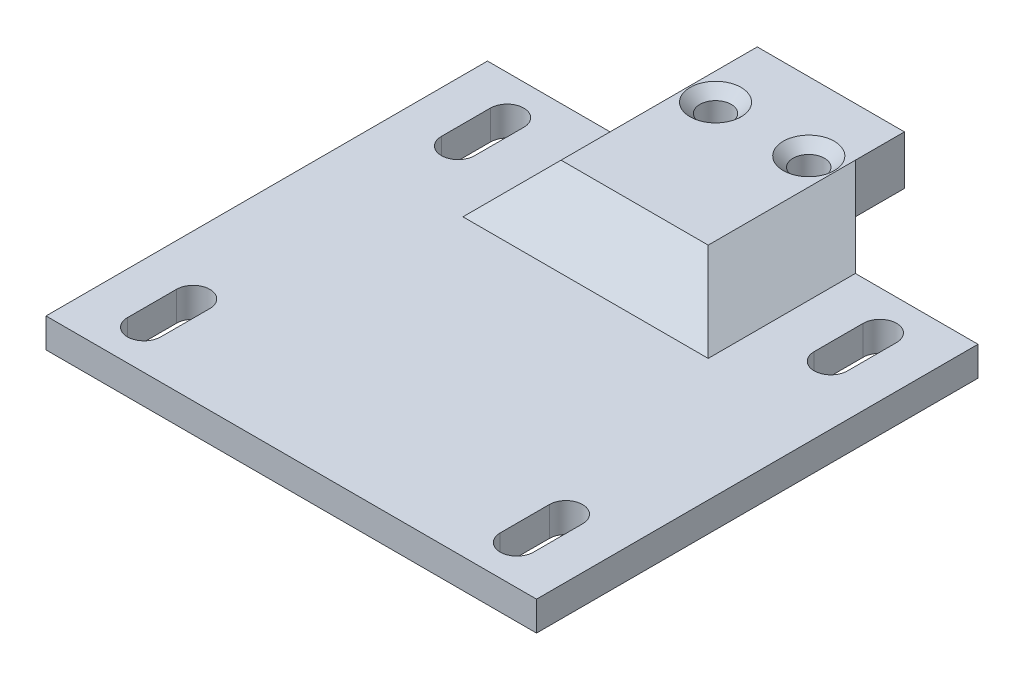
ISO-10303-21;
HEADER;
FILE_DESCRIPTION(('STEP AP214'),'2;1');
FILE_NAME('part.step','',(''),(''),'','','');
FILE_SCHEMA(('AUTOMOTIVE_DESIGN { 1 0 10303 214 1 1 1 1 }'));
ENDSEC;
DATA;
#1=APPLICATION_CONTEXT('core data for automotive mechanical design processes');
#2=APPLICATION_PROTOCOL_DEFINITION('international standard','automotive_design',2000,#1);
#3=PRODUCT_CONTEXT('',#1,'mechanical');
#4=PRODUCT('Part','Part','',(#3));
#5=PRODUCT_RELATED_PRODUCT_CATEGORY('part','',(#4));
#6=PRODUCT_DEFINITION_FORMATION('','',#4);
#7=PRODUCT_DEFINITION_CONTEXT('part definition',#1,'design');
#8=PRODUCT_DEFINITION('design','',#6,#7);
#9=PRODUCT_DEFINITION_SHAPE('','',#8);
#10=(LENGTH_UNIT() NAMED_UNIT(*) SI_UNIT(.MILLI.,.METRE.));
#11=(NAMED_UNIT(*) PLANE_ANGLE_UNIT() SI_UNIT($,.RADIAN.));
#12=(NAMED_UNIT(*) SI_UNIT($,.STERADIAN.) SOLID_ANGLE_UNIT());
#13=UNCERTAINTY_MEASURE_WITH_UNIT(LENGTH_MEASURE(1.E-05),#10,'distance_accuracy_value','');
#14=(GEOMETRIC_REPRESENTATION_CONTEXT(3) GLOBAL_UNCERTAINTY_ASSIGNED_CONTEXT((#13)) GLOBAL_UNIT_ASSIGNED_CONTEXT((#10,
#11,#12)) REPRESENTATION_CONTEXT('',''));
#15=CARTESIAN_POINT('',(0.,0.,0.));
#16=DIRECTION('',(0.,0.,1.));
#17=DIRECTION('',(1.,0.,0.));
#18=AXIS2_PLACEMENT_3D('',#15,#16,#17);
#19=CARTESIAN_POINT('',(0.,3.,22.5));
#20=DIRECTION('',(0.,0.,-1.));
#21=DIRECTION('',(-1.,0.,0.));
#22=AXIS2_PLACEMENT_3D('',#19,#20,#21);
#23=PLANE('',#22);
#24=DIRECTION('',(1.,0.,0.));
#25=VECTOR('',#24,1.);
#26=CARTESIAN_POINT('',(0.,0.,22.5));
#27=LINE('',#26,#25);
#28=CARTESIAN_POINT('',(-25.,0.,22.5));
#29=VERTEX_POINT('',#28);
#30=CARTESIAN_POINT('',(25.,0.,22.5));
#31=VERTEX_POINT('',#30);
#32=EDGE_CURVE('E405',#29,#31,#27,.T.);
#33=ORIENTED_EDGE('',*,*,#32,.T.);
#34=DIRECTION('',(0.,-1.,0.));
#35=VECTOR('',#34,1.);
#36=CARTESIAN_POINT('',(25.,3.,22.5));
#37=LINE('',#36,#35);
#38=CARTESIAN_POINT('',(25.,3.,22.5));
#39=VERTEX_POINT('',#38);
#40=EDGE_CURVE('E430',#39,#31,#37,.T.);
#41=ORIENTED_EDGE('',*,*,#40,.F.);
#42=DIRECTION('',(1.,0.,0.));
#43=VECTOR('',#42,1.);
#44=CARTESIAN_POINT('',(0.,3.,22.5));
#45=LINE('',#44,#43);
#46=CARTESIAN_POINT('',(-25.,3.,22.5));
#47=VERTEX_POINT('',#46);
#48=EDGE_CURVE('E327',#47,#39,#45,.T.);
#49=ORIENTED_EDGE('',*,*,#48,.F.);
#50=DIRECTION('',(0.,-1.,0.));
#51=VECTOR('',#50,1.);
#52=CARTESIAN_POINT('',(-25.,3.,22.5));
#53=LINE('',#52,#51);
#54=EDGE_CURVE('E420',#47,#29,#53,.T.);
#55=ORIENTED_EDGE('',*,*,#54,.T.);
#56=EDGE_LOOP('',(#33,#41,#49,#55));
#57=FACE_BOUND('',#56,.T.);
#58=ADVANCED_FACE('F51',(#57),#23,.F.);
#59=CARTESIAN_POINT('',(25.,3.,0.));
#60=DIRECTION('',(-1.,0.,0.));
#61=DIRECTION('',(0.,0.,1.));
#62=AXIS2_PLACEMENT_3D('',#59,#60,#61);
#63=PLANE('',#62);
#64=DIRECTION('',(0.,0.,-1.));
#65=VECTOR('',#64,1.);
#66=CARTESIAN_POINT('',(25.,0.,0.));
#67=LINE('',#66,#65);
#68=CARTESIAN_POINT('',(25.,0.,-22.5));
#69=VERTEX_POINT('',#68);
#70=EDGE_CURVE('E409',#31,#69,#67,.T.);
#71=ORIENTED_EDGE('',*,*,#70,.T.);
#72=DIRECTION('',(0.,-1.,0.));
#73=VECTOR('',#72,1.);
#74=CARTESIAN_POINT('',(25.,3.,-22.5));
#75=LINE('',#74,#73);
#76=CARTESIAN_POINT('',(25.,3.,-22.5));
#77=VERTEX_POINT('',#76);
#78=EDGE_CURVE('E427',#77,#69,#75,.T.);
#79=ORIENTED_EDGE('',*,*,#78,.F.);
#80=DIRECTION('',(0.,0.,-1.));
#81=VECTOR('',#80,1.);
#82=CARTESIAN_POINT('',(25.,3.,0.));
#83=LINE('',#82,#81);
#84=EDGE_CURVE('E331',#39,#77,#83,.T.);
#85=ORIENTED_EDGE('',*,*,#84,.F.);
#86=ORIENTED_EDGE('',*,*,#40,.T.);
#87=EDGE_LOOP('',(#71,#79,#85,#86));
#88=FACE_BOUND('',#87,.T.);
#89=ADVANCED_FACE('F601',(#88),#63,.F.);
#90=CARTESIAN_POINT('',(0.,3.,-22.5));
#91=DIRECTION('',(0.,0.,-1.));
#92=DIRECTION('',(-1.,0.,0.));
#93=AXIS2_PLACEMENT_3D('',#90,#91,#92);
#94=PLANE('',#93);
#95=DIRECTION('',(1.,0.,0.));
#96=VECTOR('',#95,1.);
#97=CARTESIAN_POINT('',(0.,3.,-22.5));
#98=LINE('',#97,#96);
#99=CARTESIAN_POINT('',(-12.5,3.,-22.5));
#100=VERTEX_POINT('',#99);
#101=CARTESIAN_POINT('',(12.5,3.,-22.5));
#102=VERTEX_POINT('',#101);
#103=EDGE_CURVE('E341',#100,#102,#98,.T.);
#104=ORIENTED_EDGE('',*,*,#103,.T.);
#105=EDGE_CURVE('E335',#102,#77,#98,.T.);
#106=ORIENTED_EDGE('',*,*,#105,.T.);
#107=ORIENTED_EDGE('',*,*,#78,.T.);
#108=DIRECTION('',(1.,0.,0.));
#109=VECTOR('',#108,1.);
#110=CARTESIAN_POINT('',(0.,0.,-22.5));
#111=LINE('',#110,#109);
#112=CARTESIAN_POINT('',(-25.,0.,-22.5));
#113=VERTEX_POINT('',#112);
#114=EDGE_CURVE('E413',#113,#69,#111,.T.);
#115=ORIENTED_EDGE('',*,*,#114,.F.);
#116=DIRECTION('',(0.,-1.,0.));
#117=VECTOR('',#116,1.);
#118=CARTESIAN_POINT('',(-25.,3.,-22.5));
#119=LINE('',#118,#117);
#120=CARTESIAN_POINT('',(-25.,3.,-22.5));
#121=VERTEX_POINT('',#120);
#122=EDGE_CURVE('E423',#121,#113,#119,.T.);
#123=ORIENTED_EDGE('',*,*,#122,.F.);
#124=EDGE_CURVE('E336',#121,#100,#98,.T.);
#125=ORIENTED_EDGE('',*,*,#124,.T.);
#126=EDGE_LOOP('',(#104,#106,#107,#115,#123,#125));
#127=FACE_BOUND('',#126,.T.);
#128=ADVANCED_FACE('F589',(#127),#94,.T.);
#129=CARTESIAN_POINT('',(-19.,3.,-18.5));
#130=DIRECTION('',(0.,-1.,0.));
#131=DIRECTION('',(0.,0.,-1.));
#132=AXIS2_PLACEMENT_3D('',#129,#130,#131);
#133=CYLINDRICAL_SURFACE('',#132,1.7);
#134=CARTESIAN_POINT('',(-19.,0.,-18.5));
#135=DIRECTION('',(0.,1.,0.));
#136=DIRECTION('',(0.,0.,1.));
#137=AXIS2_PLACEMENT_3D('',#134,#135,#136);
#138=CIRCLE('',#137,1.7);
#139=CARTESIAN_POINT('',(-17.3,0.,-18.5));
#140=VERTEX_POINT('',#139);
#141=CARTESIAN_POINT('',(-20.7,0.,-18.5));
#142=VERTEX_POINT('',#141);
#143=EDGE_CURVE('E389',#140,#142,#138,.T.);
#144=ORIENTED_EDGE('',*,*,#143,.F.);
#145=DIRECTION('',(0.,-1.,0.));
#146=VECTOR('',#145,1.);
#147=CARTESIAN_POINT('',(-17.3,3.,-18.5));
#148=LINE('',#147,#146);
#149=CARTESIAN_POINT('',(-17.3,3.,-18.5));
#150=VERTEX_POINT('',#149);
#151=EDGE_CURVE('E424',#150,#140,#148,.T.);
#152=ORIENTED_EDGE('',*,*,#151,.F.);
#153=CARTESIAN_POINT('',(-19.,3.,-18.5));
#154=DIRECTION('',(0.,1.,0.));
#155=DIRECTION('',(0.,0.,1.));
#156=AXIS2_PLACEMENT_3D('',#153,#154,#155);
#157=CIRCLE('',#156,1.7);
#158=CARTESIAN_POINT('',(-20.7,3.,-18.5));
#159=VERTEX_POINT('',#158);
#160=EDGE_CURVE('E313',#150,#159,#157,.T.);
#161=ORIENTED_EDGE('',*,*,#160,.T.);
#162=DIRECTION('',(0.,-1.,0.));
#163=VECTOR('',#162,1.);
#164=CARTESIAN_POINT('',(-20.7,3.,-18.5));
#165=LINE('',#164,#163);
#166=EDGE_CURVE('E435',#159,#142,#165,.T.);
#167=ORIENTED_EDGE('',*,*,#166,.T.);
#168=EDGE_LOOP('',(#144,#152,#161,#167));
#169=FACE_BOUND('',#168,.T.);
#170=ADVANCED_FACE('F725',(#169),#133,.F.);
#171=CARTESIAN_POINT('',(-17.3,3.,0.));
#172=DIRECTION('',(-1.,0.,0.));
#173=DIRECTION('',(0.,0.,1.));
#174=AXIS2_PLACEMENT_3D('',#171,#172,#173);
#175=PLANE('',#174);
#176=DIRECTION('',(0.,0.,-1.));
#177=VECTOR('',#176,1.);
#178=CARTESIAN_POINT('',(-17.3,0.,0.));
#179=LINE('',#178,#177);
#180=CARTESIAN_POINT('',(-17.3,0.,-13.5));
#181=VERTEX_POINT('',#180);
#182=EDGE_CURVE('E393',#181,#140,#179,.T.);
#183=ORIENTED_EDGE('',*,*,#182,.F.);
#184=DIRECTION('',(0.,-1.,0.));
#185=VECTOR('',#184,1.);
#186=CARTESIAN_POINT('',(-17.3,3.,-13.5));
#187=LINE('',#186,#185);
#188=CARTESIAN_POINT('',(-17.3,3.,-13.5));
#189=VERTEX_POINT('',#188);
#190=EDGE_CURVE('E442',#189,#181,#187,.T.);
#191=ORIENTED_EDGE('',*,*,#190,.F.);
#192=DIRECTION('',(0.,0.,-1.));
#193=VECTOR('',#192,1.);
#194=CARTESIAN_POINT('',(-17.3,3.,0.));
#195=LINE('',#194,#193);
#196=EDGE_CURVE('E317',#189,#150,#195,.T.);
#197=ORIENTED_EDGE('',*,*,#196,.T.);
#198=ORIENTED_EDGE('',*,*,#151,.T.);
#199=EDGE_LOOP('',(#183,#191,#197,#198));
#200=FACE_BOUND('',#199,.T.);
#201=ADVANCED_FACE('F721',(#200),#175,.T.);
#202=CARTESIAN_POINT('',(-19.,3.,-13.5));
#203=DIRECTION('',(0.,-1.,0.));
#204=DIRECTION('',(0.,0.,-1.));
#205=AXIS2_PLACEMENT_3D('',#202,#203,#204);
#206=CYLINDRICAL_SURFACE('',#205,1.7);
#207=CARTESIAN_POINT('',(-19.,0.,-13.5));
#208=DIRECTION('',(0.,1.,0.));
#209=DIRECTION('',(0.,0.,1.));
#210=AXIS2_PLACEMENT_3D('',#207,#208,#209);
#211=CIRCLE('',#210,1.7);
#212=CARTESIAN_POINT('',(-20.7,0.,-13.5));
#213=VERTEX_POINT('',#212);
#214=EDGE_CURVE('E397',#213,#181,#211,.T.);
#215=ORIENTED_EDGE('',*,*,#214,.F.);
#216=DIRECTION('',(0.,-1.,0.));
#217=VECTOR('',#216,1.);
#218=CARTESIAN_POINT('',(-20.7,3.,-13.5));
#219=LINE('',#218,#217);
#220=CARTESIAN_POINT('',(-20.7,3.,-13.5));
#221=VERTEX_POINT('',#220);
#222=EDGE_CURVE('E438',#221,#213,#219,.T.);
#223=ORIENTED_EDGE('',*,*,#222,.F.);
#224=CARTESIAN_POINT('',(-19.,3.,-13.5));
#225=DIRECTION('',(0.,1.,0.));
#226=DIRECTION('',(0.,0.,1.));
#227=AXIS2_PLACEMENT_3D('',#224,#225,#226);
#228=CIRCLE('',#227,1.7);
#229=EDGE_CURVE('E320',#221,#189,#228,.T.);
#230=ORIENTED_EDGE('',*,*,#229,.T.);
#231=ORIENTED_EDGE('',*,*,#190,.T.);
#232=EDGE_LOOP('',(#215,#223,#230,#231));
#233=FACE_BOUND('',#232,.T.);
#234=ADVANCED_FACE('F717',(#233),#206,.F.);
#235=CARTESIAN_POINT('',(19.,3.,-18.5));
#236=DIRECTION('',(0.,-1.,0.));
#237=DIRECTION('',(0.,0.,-1.));
#238=AXIS2_PLACEMENT_3D('',#235,#236,#237);
#239=CYLINDRICAL_SURFACE('',#238,1.7);
#240=CARTESIAN_POINT('',(19.,0.,-18.5));
#241=DIRECTION('',(0.,1.,0.));
#242=DIRECTION('',(0.,0.,1.));
#243=AXIS2_PLACEMENT_3D('',#240,#241,#242);
#244=CIRCLE('',#243,1.7);
#245=CARTESIAN_POINT('',(20.7,0.,-18.5));
#246=VERTEX_POINT('',#245);
#247=CARTESIAN_POINT('',(17.3,0.,-18.5));
#248=VERTEX_POINT('',#247);
#249=EDGE_CURVE('E373',#246,#248,#244,.T.);
#250=ORIENTED_EDGE('',*,*,#249,.F.);
#251=DIRECTION('',(0.,-1.,0.));
#252=VECTOR('',#251,1.);
#253=CARTESIAN_POINT('',(20.7,3.,-18.5));
#254=LINE('',#253,#252);
#255=CARTESIAN_POINT('',(20.7,3.,-18.5));
#256=VERTEX_POINT('',#255);
#257=EDGE_CURVE('E439',#256,#246,#254,.T.);
#258=ORIENTED_EDGE('',*,*,#257,.F.);
#259=CARTESIAN_POINT('',(19.,3.,-18.5));
#260=DIRECTION('',(0.,1.,0.));
#261=DIRECTION('',(0.,0.,1.));
#262=AXIS2_PLACEMENT_3D('',#259,#260,#261);
#263=CIRCLE('',#262,1.7);
#264=CARTESIAN_POINT('',(17.3,3.,-18.5));
#265=VERTEX_POINT('',#264);
#266=EDGE_CURVE('E298',#256,#265,#263,.T.);
#267=ORIENTED_EDGE('',*,*,#266,.T.);
#268=DIRECTION('',(0.,-1.,0.));
#269=VECTOR('',#268,1.);
#270=CARTESIAN_POINT('',(17.3,3.,-18.5));
#271=LINE('',#270,#269);
#272=EDGE_CURVE('E447',#265,#248,#271,.T.);
#273=ORIENTED_EDGE('',*,*,#272,.T.);
#274=EDGE_LOOP('',(#250,#258,#267,#273));
#275=FACE_BOUND('',#274,.T.);
#276=ADVANCED_FACE('F720',(#275),#239,.F.);
#277=CARTESIAN_POINT('',(20.7,3.,0.));
#278=DIRECTION('',(-1.,0.,0.));
#279=DIRECTION('',(0.,0.,1.));
#280=AXIS2_PLACEMENT_3D('',#277,#278,#279);
#281=PLANE('',#280);
#282=DIRECTION('',(0.,0.,-1.));
#283=VECTOR('',#282,1.);
#284=CARTESIAN_POINT('',(20.7,0.,0.));
#285=LINE('',#284,#283);
#286=CARTESIAN_POINT('',(20.7,0.,-13.5));
#287=VERTEX_POINT('',#286);
#288=EDGE_CURVE('E377',#287,#246,#285,.T.);
#289=ORIENTED_EDGE('',*,*,#288,.F.);
#290=DIRECTION('',(0.,-1.,0.));
#291=VECTOR('',#290,1.);
#292=CARTESIAN_POINT('',(20.7,3.,-13.5));
#293=LINE('',#292,#291);
#294=CARTESIAN_POINT('',(20.7,3.,-13.5));
#295=VERTEX_POINT('',#294);
#296=EDGE_CURVE('E454',#295,#287,#293,.T.);
#297=ORIENTED_EDGE('',*,*,#296,.F.);
#298=DIRECTION('',(0.,0.,-1.));
#299=VECTOR('',#298,1.);
#300=CARTESIAN_POINT('',(20.7,3.,0.));
#301=LINE('',#300,#299);
#302=EDGE_CURVE('E302',#295,#256,#301,.T.);
#303=ORIENTED_EDGE('',*,*,#302,.T.);
#304=ORIENTED_EDGE('',*,*,#257,.T.);
#305=EDGE_LOOP('',(#289,#297,#303,#304));
#306=FACE_BOUND('',#305,.T.);
#307=ADVANCED_FACE('F738',(#306),#281,.T.);
#308=CARTESIAN_POINT('',(19.,3.,-13.5));
#309=DIRECTION('',(0.,-1.,0.));
#310=DIRECTION('',(0.,0.,-1.));
#311=AXIS2_PLACEMENT_3D('',#308,#309,#310);
#312=CYLINDRICAL_SURFACE('',#311,1.7);
#313=CARTESIAN_POINT('',(19.,0.,-13.5));
#314=DIRECTION('',(0.,1.,0.));
#315=DIRECTION('',(0.,0.,1.));
#316=AXIS2_PLACEMENT_3D('',#313,#314,#315);
#317=CIRCLE('',#316,1.7);
#318=CARTESIAN_POINT('',(17.3,0.,-13.5));
#319=VERTEX_POINT('',#318);
#320=EDGE_CURVE('E381',#319,#287,#317,.T.);
#321=ORIENTED_EDGE('',*,*,#320,.F.);
#322=DIRECTION('',(0.,-1.,0.));
#323=VECTOR('',#322,1.);
#324=CARTESIAN_POINT('',(17.3,3.,-13.5));
#325=LINE('',#324,#323);
#326=CARTESIAN_POINT('',(17.3,3.,-13.5));
#327=VERTEX_POINT('',#326);
#328=EDGE_CURVE('E450',#327,#319,#325,.T.);
#329=ORIENTED_EDGE('',*,*,#328,.F.);
#330=CARTESIAN_POINT('',(19.,3.,-13.5));
#331=DIRECTION('',(0.,1.,0.));
#332=DIRECTION('',(0.,0.,1.));
#333=AXIS2_PLACEMENT_3D('',#330,#331,#332);
#334=CIRCLE('',#333,1.7);
#335=EDGE_CURVE('E306',#327,#295,#334,.T.);
#336=ORIENTED_EDGE('',*,*,#335,.T.);
#337=ORIENTED_EDGE('',*,*,#296,.T.);
#338=EDGE_LOOP('',(#321,#329,#336,#337));
#339=FACE_BOUND('',#338,.T.);
#340=ADVANCED_FACE('F734',(#339),#312,.F.);
#341=CARTESIAN_POINT('',(-19.,3.,13.5));
#342=DIRECTION('',(0.,-1.,0.));
#343=DIRECTION('',(0.,0.,-1.));
#344=AXIS2_PLACEMENT_3D('',#341,#342,#343);
#345=CYLINDRICAL_SURFACE('',#344,1.7);
#346=CARTESIAN_POINT('',(-19.,0.,13.5));
#347=DIRECTION('',(0.,1.,0.));
#348=DIRECTION('',(0.,0.,1.));
#349=AXIS2_PLACEMENT_3D('',#346,#347,#348);
#350=CIRCLE('',#349,1.7);
#351=CARTESIAN_POINT('',(-17.3,0.,13.5));
#352=VERTEX_POINT('',#351);
#353=CARTESIAN_POINT('',(-20.7,0.,13.5));
#354=VERTEX_POINT('',#353);
#355=EDGE_CURVE('E357',#352,#354,#350,.T.);
#356=ORIENTED_EDGE('',*,*,#355,.F.);
#357=DIRECTION('',(0.,-1.,0.));
#358=VECTOR('',#357,1.);
#359=CARTESIAN_POINT('',(-17.3,3.,13.5));
#360=LINE('',#359,#358);
#361=CARTESIAN_POINT('',(-17.3,3.,13.5));
#362=VERTEX_POINT('',#361);
#363=EDGE_CURVE('E451',#362,#352,#360,.T.);
#364=ORIENTED_EDGE('',*,*,#363,.F.);
#365=CARTESIAN_POINT('',(-19.,3.,13.5));
#366=DIRECTION('',(0.,1.,0.));
#367=DIRECTION('',(0.,0.,1.));
#368=AXIS2_PLACEMENT_3D('',#365,#366,#367);
#369=CIRCLE('',#368,1.7);
#370=CARTESIAN_POINT('',(-20.7,3.,13.5));
#371=VERTEX_POINT('',#370);
#372=EDGE_CURVE('E283',#362,#371,#369,.T.);
#373=ORIENTED_EDGE('',*,*,#372,.T.);
#374=DIRECTION('',(0.,-1.,0.));
#375=VECTOR('',#374,1.);
#376=CARTESIAN_POINT('',(-20.7,3.,13.5));
#377=LINE('',#376,#375);
#378=EDGE_CURVE('E459',#371,#354,#377,.T.);
#379=ORIENTED_EDGE('',*,*,#378,.T.);
#380=EDGE_LOOP('',(#356,#364,#373,#379));
#381=FACE_BOUND('',#380,.T.);
#382=ADVANCED_FACE('F737',(#381),#345,.F.);
#383=CARTESIAN_POINT('',(-17.3,3.,0.));
#384=DIRECTION('',(-1.,0.,0.));
#385=DIRECTION('',(0.,0.,1.));
#386=AXIS2_PLACEMENT_3D('',#383,#384,#385);
#387=PLANE('',#386);
#388=DIRECTION('',(0.,0.,-1.));
#389=VECTOR('',#388,1.);
#390=CARTESIAN_POINT('',(-17.3,0.,0.));
#391=LINE('',#390,#389);
#392=CARTESIAN_POINT('',(-17.3,0.,18.5));
#393=VERTEX_POINT('',#392);
#394=EDGE_CURVE('E361',#393,#352,#391,.T.);
#395=ORIENTED_EDGE('',*,*,#394,.F.);
#396=DIRECTION('',(0.,-1.,0.));
#397=VECTOR('',#396,1.);
#398=CARTESIAN_POINT('',(-17.3,3.,18.5));
#399=LINE('',#398,#397);
#400=CARTESIAN_POINT('',(-17.3,3.,18.5));
#401=VERTEX_POINT('',#400);
#402=EDGE_CURVE('E466',#401,#393,#399,.T.);
#403=ORIENTED_EDGE('',*,*,#402,.F.);
#404=DIRECTION('',(0.,0.,-1.));
#405=VECTOR('',#404,1.);
#406=CARTESIAN_POINT('',(-17.3,3.,0.));
#407=LINE('',#406,#405);
#408=EDGE_CURVE('E287',#401,#362,#407,.T.);
#409=ORIENTED_EDGE('',*,*,#408,.T.);
#410=ORIENTED_EDGE('',*,*,#363,.T.);
#411=EDGE_LOOP('',(#395,#403,#409,#410));
#412=FACE_BOUND('',#411,.T.);
#413=ADVANCED_FACE('F754',(#412),#387,.T.);
#414=CARTESIAN_POINT('',(-19.,3.,18.5));
#415=DIRECTION('',(0.,-1.,0.));
#416=DIRECTION('',(0.,0.,-1.));
#417=AXIS2_PLACEMENT_3D('',#414,#415,#416);
#418=CYLINDRICAL_SURFACE('',#417,1.7);
#419=CARTESIAN_POINT('',(-19.,0.,18.5));
#420=DIRECTION('',(0.,1.,0.));
#421=DIRECTION('',(0.,0.,1.));
#422=AXIS2_PLACEMENT_3D('',#419,#420,#421);
#423=CIRCLE('',#422,1.7);
#424=CARTESIAN_POINT('',(-20.7,0.,18.5));
#425=VERTEX_POINT('',#424);
#426=EDGE_CURVE('E365',#425,#393,#423,.T.);
#427=ORIENTED_EDGE('',*,*,#426,.F.);
#428=DIRECTION('',(0.,-1.,0.));
#429=VECTOR('',#428,1.);
#430=CARTESIAN_POINT('',(-20.7,3.,18.5));
#431=LINE('',#430,#429);
#432=CARTESIAN_POINT('',(-20.7,3.,18.5));
#433=VERTEX_POINT('',#432);
#434=EDGE_CURVE('E462',#433,#425,#431,.T.);
#435=ORIENTED_EDGE('',*,*,#434,.F.);
#436=CARTESIAN_POINT('',(-19.,3.,18.5));
#437=DIRECTION('',(0.,1.,0.));
#438=DIRECTION('',(0.,0.,1.));
#439=AXIS2_PLACEMENT_3D('',#436,#437,#438);
#440=CIRCLE('',#439,1.7);
#441=EDGE_CURVE('E291',#433,#401,#440,.T.);
#442=ORIENTED_EDGE('',*,*,#441,.T.);
#443=ORIENTED_EDGE('',*,*,#402,.T.);
#444=EDGE_LOOP('',(#427,#435,#442,#443));
#445=FACE_BOUND('',#444,.T.);
#446=ADVANCED_FACE('F750',(#445),#418,.F.);
#447=CARTESIAN_POINT('',(19.,3.,13.5));
#448=DIRECTION('',(0.,-1.,0.));
#449=DIRECTION('',(0.,0.,-1.));
#450=AXIS2_PLACEMENT_3D('',#447,#448,#449);
#451=CYLINDRICAL_SURFACE('',#450,1.7);
#452=CARTESIAN_POINT('',(19.,0.,13.5));
#453=DIRECTION('',(0.,1.,0.));
#454=DIRECTION('',(0.,0.,1.));
#455=AXIS2_PLACEMENT_3D('',#452,#453,#454);
#456=CIRCLE('',#455,1.7);
#457=CARTESIAN_POINT('',(20.7,0.,13.5));
#458=VERTEX_POINT('',#457);
#459=CARTESIAN_POINT('',(17.3,0.,13.5));
#460=VERTEX_POINT('',#459);
#461=EDGE_CURVE('E253',#458,#460,#456,.T.);
#462=ORIENTED_EDGE('',*,*,#461,.F.);
#463=DIRECTION('',(0.,-1.,0.));
#464=VECTOR('',#463,1.);
#465=CARTESIAN_POINT('',(20.7,3.,13.5));
#466=LINE('',#465,#464);
#467=CARTESIAN_POINT('',(20.7,3.,13.5));
#468=VERTEX_POINT('',#467);
#469=EDGE_CURVE('E463',#468,#458,#466,.T.);
#470=ORIENTED_EDGE('',*,*,#469,.F.);
#471=CARTESIAN_POINT('',(19.,3.,13.5));
#472=DIRECTION('',(0.,1.,0.));
#473=DIRECTION('',(0.,0.,1.));
#474=AXIS2_PLACEMENT_3D('',#471,#472,#473);
#475=CIRCLE('',#474,1.7);
#476=CARTESIAN_POINT('',(17.3,3.,13.5));
#477=VERTEX_POINT('',#476);
#478=EDGE_CURVE('E267',#468,#477,#475,.T.);
#479=ORIENTED_EDGE('',*,*,#478,.T.);
#480=DIRECTION('',(0.,-1.,0.));
#481=VECTOR('',#480,1.);
#482=CARTESIAN_POINT('',(17.3,3.,13.5));
#483=LINE('',#482,#481);
#484=EDGE_CURVE('E344',#477,#460,#483,.T.);
#485=ORIENTED_EDGE('',*,*,#484,.T.);
#486=EDGE_LOOP('',(#462,#470,#479,#485));
#487=FACE_BOUND('',#486,.T.);
#488=ADVANCED_FACE('F753',(#487),#451,.F.);
#489=CARTESIAN_POINT('',(20.7,3.,0.));
#490=DIRECTION('',(-1.,0.,0.));
#491=DIRECTION('',(0.,0.,1.));
#492=AXIS2_PLACEMENT_3D('',#489,#490,#491);
#493=PLANE('',#492);
#494=DIRECTION('',(0.,0.,-1.));
#495=VECTOR('',#494,1.);
#496=CARTESIAN_POINT('',(20.7,0.,0.));
#497=LINE('',#496,#495);
#498=CARTESIAN_POINT('',(20.7,0.,18.5));
#499=VERTEX_POINT('',#498);
#500=EDGE_CURVE('E260',#499,#458,#497,.T.);
#501=ORIENTED_EDGE('',*,*,#500,.F.);
#502=DIRECTION('',(0.,-1.,0.));
#503=VECTOR('',#502,1.);
#504=CARTESIAN_POINT('',(20.7,3.,18.5));
#505=LINE('',#504,#503);
#506=CARTESIAN_POINT('',(20.7,3.,18.5));
#507=VERTEX_POINT('',#506);
#508=EDGE_CURVE('E475',#507,#499,#505,.T.);
#509=ORIENTED_EDGE('',*,*,#508,.F.);
#510=DIRECTION('',(0.,0.,-1.));
#511=VECTOR('',#510,1.);
#512=CARTESIAN_POINT('',(20.7,3.,0.));
#513=LINE('',#512,#511);
#514=EDGE_CURVE('E271',#507,#468,#513,.T.);
#515=ORIENTED_EDGE('',*,*,#514,.T.);
#516=ORIENTED_EDGE('',*,*,#469,.T.);
#517=EDGE_LOOP('',(#501,#509,#515,#516));
#518=FACE_BOUND('',#517,.T.);
#519=ADVANCED_FACE('F767',(#518),#493,.T.);
#520=CARTESIAN_POINT('',(19.,3.,18.5));
#521=DIRECTION('',(0.,-1.,0.));
#522=DIRECTION('',(0.,0.,-1.));
#523=AXIS2_PLACEMENT_3D('',#520,#521,#522);
#524=CYLINDRICAL_SURFACE('',#523,1.7);
#525=CARTESIAN_POINT('',(19.,0.,18.5));
#526=DIRECTION('',(0.,1.,0.));
#527=DIRECTION('',(0.,0.,1.));
#528=AXIS2_PLACEMENT_3D('',#525,#526,#527);
#529=CIRCLE('',#528,1.7);
#530=CARTESIAN_POINT('',(17.3,0.,18.5));
#531=VERTEX_POINT('',#530);
#532=EDGE_CURVE('E349',#531,#499,#529,.T.);
#533=ORIENTED_EDGE('',*,*,#532,.F.);
#534=DIRECTION('',(0.,-1.,0.));
#535=VECTOR('',#534,1.);
#536=CARTESIAN_POINT('',(17.3,3.,18.5));
#537=LINE('',#536,#535);
#538=CARTESIAN_POINT('',(17.3,3.,18.5));
#539=VERTEX_POINT('',#538);
#540=EDGE_CURVE('E472',#539,#531,#537,.T.);
#541=ORIENTED_EDGE('',*,*,#540,.F.);
#542=CARTESIAN_POINT('',(19.,3.,18.5));
#543=DIRECTION('',(0.,1.,0.));
#544=DIRECTION('',(0.,0.,1.));
#545=AXIS2_PLACEMENT_3D('',#542,#543,#544);
#546=CIRCLE('',#545,1.7);
#547=EDGE_CURVE('E276',#539,#507,#546,.T.);
#548=ORIENTED_EDGE('',*,*,#547,.T.);
#549=ORIENTED_EDGE('',*,*,#508,.T.);
#550=EDGE_LOOP('',(#533,#541,#548,#549));
#551=FACE_BOUND('',#550,.T.);
#552=ADVANCED_FACE('F715',(#551),#524,.F.);
#553=CARTESIAN_POINT('',(-20.7,3.,0.));
#554=DIRECTION('',(-1.,0.,0.));
#555=DIRECTION('',(0.,0.,1.));
#556=AXIS2_PLACEMENT_3D('',#553,#554,#555);
#557=PLANE('',#556);
#558=DIRECTION('',(0.,0.,-1.));
#559=VECTOR('',#558,1.);
#560=CARTESIAN_POINT('',(-20.7,0.,0.));
#561=LINE('',#560,#559);
#562=EDGE_CURVE('E401',#213,#142,#561,.T.);
#563=ORIENTED_EDGE('',*,*,#562,.T.);
#564=ORIENTED_EDGE('',*,*,#166,.F.);
#565=DIRECTION('',(0.,0.,-1.));
#566=VECTOR('',#565,1.);
#567=CARTESIAN_POINT('',(-20.7,3.,0.));
#568=LINE('',#567,#566);
#569=EDGE_CURVE('E324',#221,#159,#568,.T.);
#570=ORIENTED_EDGE('',*,*,#569,.F.);
#571=ORIENTED_EDGE('',*,*,#222,.T.);
#572=EDGE_LOOP('',(#563,#564,#570,#571));
#573=FACE_BOUND('',#572,.T.);
#574=ADVANCED_FACE('F711',(#573),#557,.F.);
#575=CARTESIAN_POINT('',(17.3,3.,0.));
#576=DIRECTION('',(-1.,0.,0.));
#577=DIRECTION('',(0.,0.,1.));
#578=AXIS2_PLACEMENT_3D('',#575,#576,#577);
#579=PLANE('',#578);
#580=DIRECTION('',(0.,0.,-1.));
#581=VECTOR('',#580,1.);
#582=CARTESIAN_POINT('',(17.3,0.,0.));
#583=LINE('',#582,#581);
#584=EDGE_CURVE('E385',#319,#248,#583,.T.);
#585=ORIENTED_EDGE('',*,*,#584,.T.);
#586=ORIENTED_EDGE('',*,*,#272,.F.);
#587=DIRECTION('',(0.,0.,-1.));
#588=VECTOR('',#587,1.);
#589=CARTESIAN_POINT('',(17.3,3.,0.));
#590=LINE('',#589,#588);
#591=EDGE_CURVE('E310',#327,#265,#590,.T.);
#592=ORIENTED_EDGE('',*,*,#591,.F.);
#593=ORIENTED_EDGE('',*,*,#328,.T.);
#594=EDGE_LOOP('',(#585,#586,#592,#593));
#595=FACE_BOUND('',#594,.T.);
#596=ADVANCED_FACE('F714',(#595),#579,.F.);
#597=CARTESIAN_POINT('',(-20.7,3.,0.));
#598=DIRECTION('',(-1.,0.,0.));
#599=DIRECTION('',(0.,0.,1.));
#600=AXIS2_PLACEMENT_3D('',#597,#598,#599);
#601=PLANE('',#600);
#602=DIRECTION('',(0.,0.,-1.));
#603=VECTOR('',#602,1.);
#604=CARTESIAN_POINT('',(-20.7,0.,0.));
#605=LINE('',#604,#603);
#606=EDGE_CURVE('E369',#425,#354,#605,.T.);
#607=ORIENTED_EDGE('',*,*,#606,.T.);
#608=ORIENTED_EDGE('',*,*,#378,.F.);
#609=DIRECTION('',(0.,0.,-1.));
#610=VECTOR('',#609,1.);
#611=CARTESIAN_POINT('',(-20.7,3.,0.));
#612=LINE('',#611,#610);
#613=EDGE_CURVE('E295',#433,#371,#612,.T.);
#614=ORIENTED_EDGE('',*,*,#613,.F.);
#615=ORIENTED_EDGE('',*,*,#434,.T.);
#616=EDGE_LOOP('',(#607,#608,#614,#615));
#617=FACE_BOUND('',#616,.T.);
#618=ADVANCED_FACE('F732',(#617),#601,.F.);
#619=CARTESIAN_POINT('',(17.3,3.,0.));
#620=DIRECTION('',(-1.,0.,0.));
#621=DIRECTION('',(0.,0.,1.));
#622=AXIS2_PLACEMENT_3D('',#619,#620,#621);
#623=PLANE('',#622);
#624=DIRECTION('',(0.,0.,-1.));
#625=VECTOR('',#624,1.);
#626=CARTESIAN_POINT('',(17.3,0.,0.));
#627=LINE('',#626,#625);
#628=EDGE_CURVE('E353',#531,#460,#627,.T.);
#629=ORIENTED_EDGE('',*,*,#628,.T.);
#630=ORIENTED_EDGE('',*,*,#484,.F.);
#631=DIRECTION('',(0.,0.,-1.));
#632=VECTOR('',#631,1.);
#633=CARTESIAN_POINT('',(17.3,3.,0.));
#634=LINE('',#633,#632);
#635=EDGE_CURVE('E280',#539,#477,#634,.T.);
#636=ORIENTED_EDGE('',*,*,#635,.F.);
#637=ORIENTED_EDGE('',*,*,#540,.T.);
#638=EDGE_LOOP('',(#629,#630,#636,#637));
#639=FACE_BOUND('',#638,.T.);
#640=ADVANCED_FACE('F748',(#639),#623,.F.);
#641=CARTESIAN_POINT('',(-25.,3.,0.));
#642=DIRECTION('',(-1.,0.,0.));
#643=DIRECTION('',(0.,0.,1.));
#644=AXIS2_PLACEMENT_3D('',#641,#642,#643);
#645=PLANE('',#644);
#646=DIRECTION('',(0.,0.,-1.));
#647=VECTOR('',#646,1.);
#648=CARTESIAN_POINT('',(-25.,0.,0.));
#649=LINE('',#648,#647);
#650=EDGE_CURVE('E272',#29,#113,#649,.T.);
#651=ORIENTED_EDGE('',*,*,#650,.F.);
#652=ORIENTED_EDGE('',*,*,#54,.F.);
#653=DIRECTION('',(0.,0.,-1.));
#654=VECTOR('',#653,1.);
#655=CARTESIAN_POINT('',(-25.,3.,0.));
#656=LINE('',#655,#654);
#657=EDGE_CURVE('E340',#47,#121,#656,.T.);
#658=ORIENTED_EDGE('',*,*,#657,.T.);
#659=ORIENTED_EDGE('',*,*,#122,.T.);
#660=EDGE_LOOP('',(#651,#652,#658,#659));
#661=FACE_BOUND('',#660,.T.);
#662=ADVANCED_FACE('F593',(#661),#645,.T.);
#663=CARTESIAN_POINT('',(0.,3.,0.));
#664=DIRECTION('',(0.,1.,0.));
#665=DIRECTION('',(0.,0.,1.));
#666=AXIS2_PLACEMENT_3D('',#663,#664,#665);
#667=PLANE('',#666);
#668=DIRECTION('',(-1.,0.,0.));
#669=VECTOR('',#668,1.);
#670=CARTESIAN_POINT('',(0.,3.,-7.50000000000002));
#671=LINE('',#670,#669);
#672=CARTESIAN_POINT('',(12.5,3.,-7.50000000000002));
#673=VERTEX_POINT('',#672);
#674=CARTESIAN_POINT('',(-12.5,3.,-7.50000000000002));
#675=VERTEX_POINT('',#674);
#676=EDGE_CURVE('E434',#673,#675,#671,.T.);
#677=ORIENTED_EDGE('',*,*,#676,.T.);
#678=DIRECTION('',(0.,0.,-1.));
#679=VECTOR('',#678,1.);
#680=CARTESIAN_POINT('',(-12.5,3.,0.));
#681=LINE('',#680,#679);
#682=EDGE_CURVE('E485',#675,#100,#681,.T.);
#683=ORIENTED_EDGE('',*,*,#682,.T.);
#684=ORIENTED_EDGE('',*,*,#124,.F.);
#685=ORIENTED_EDGE('',*,*,#657,.F.);
#686=ORIENTED_EDGE('',*,*,#48,.T.);
#687=ORIENTED_EDGE('',*,*,#84,.T.);
#688=ORIENTED_EDGE('',*,*,#105,.F.);
#689=DIRECTION('',(0.,0.,1.));
#690=VECTOR('',#689,1.);
#691=CARTESIAN_POINT('',(12.5,3.,0.));
#692=LINE('',#691,#690);
#693=EDGE_CURVE('E482',#102,#673,#692,.T.);
#694=ORIENTED_EDGE('',*,*,#693,.T.);
#695=EDGE_LOOP('',(#677,#683,#684,#685,#686,#687,#688,#694));
#696=FACE_BOUND('',#695,.T.);
#697=ORIENTED_EDGE('',*,*,#478,.F.);
#698=ORIENTED_EDGE('',*,*,#514,.F.);
#699=ORIENTED_EDGE('',*,*,#547,.F.);
#700=ORIENTED_EDGE('',*,*,#635,.T.);
#701=EDGE_LOOP('',(#697,#698,#699,#700));
#702=FACE_BOUND('',#701,.T.);
#703=ORIENTED_EDGE('',*,*,#372,.F.);
#704=ORIENTED_EDGE('',*,*,#408,.F.);
#705=ORIENTED_EDGE('',*,*,#441,.F.);
#706=ORIENTED_EDGE('',*,*,#613,.T.);
#707=EDGE_LOOP('',(#703,#704,#705,#706));
#708=FACE_BOUND('',#707,.T.);
#709=ORIENTED_EDGE('',*,*,#266,.F.);
#710=ORIENTED_EDGE('',*,*,#302,.F.);
#711=ORIENTED_EDGE('',*,*,#335,.F.);
#712=ORIENTED_EDGE('',*,*,#591,.T.);
#713=EDGE_LOOP('',(#709,#710,#711,#712));
#714=FACE_BOUND('',#713,.T.);
#715=ORIENTED_EDGE('',*,*,#160,.F.);
#716=ORIENTED_EDGE('',*,*,#196,.F.);
#717=ORIENTED_EDGE('',*,*,#229,.F.);
#718=ORIENTED_EDGE('',*,*,#569,.T.);
#719=EDGE_LOOP('',(#715,#716,#717,#718));
#720=FACE_BOUND('',#719,.T.);
#721=ADVANCED_FACE('F584',(#696,#702,#708,#714,#720),#667,.T.);
#722=CARTESIAN_POINT('',(0.,0.,0.));
#723=DIRECTION('',(0.,1.,0.));
#724=DIRECTION('',(0.,0.,1.));
#725=AXIS2_PLACEMENT_3D('',#722,#723,#724);
#726=PLANE('',#725);
#727=ORIENTED_EDGE('',*,*,#461,.T.);
#728=ORIENTED_EDGE('',*,*,#628,.F.);
#729=ORIENTED_EDGE('',*,*,#532,.T.);
#730=ORIENTED_EDGE('',*,*,#500,.T.);
#731=EDGE_LOOP('',(#727,#728,#729,#730));
#732=FACE_BOUND('',#731,.T.);
#733=ORIENTED_EDGE('',*,*,#355,.T.);
#734=ORIENTED_EDGE('',*,*,#606,.F.);
#735=ORIENTED_EDGE('',*,*,#426,.T.);
#736=ORIENTED_EDGE('',*,*,#394,.T.);
#737=EDGE_LOOP('',(#733,#734,#735,#736));
#738=FACE_BOUND('',#737,.T.);
#739=ORIENTED_EDGE('',*,*,#249,.T.);
#740=ORIENTED_EDGE('',*,*,#584,.F.);
#741=ORIENTED_EDGE('',*,*,#320,.T.);
#742=ORIENTED_EDGE('',*,*,#288,.T.);
#743=EDGE_LOOP('',(#739,#740,#741,#742));
#744=FACE_BOUND('',#743,.T.);
#745=ORIENTED_EDGE('',*,*,#143,.T.);
#746=ORIENTED_EDGE('',*,*,#562,.F.);
#747=ORIENTED_EDGE('',*,*,#214,.T.);
#748=ORIENTED_EDGE('',*,*,#182,.T.);
#749=EDGE_LOOP('',(#745,#746,#747,#748));
#750=FACE_BOUND('',#749,.T.);
#751=ORIENTED_EDGE('',*,*,#32,.F.);
#752=ORIENTED_EDGE('',*,*,#650,.T.);
#753=ORIENTED_EDGE('',*,*,#114,.T.);
#754=ORIENTED_EDGE('',*,*,#70,.F.);
#755=EDGE_LOOP('',(#751,#752,#753,#754));
#756=FACE_BOUND('',#755,.T.);
#757=ADVANCED_FACE('F800',(#732,#738,#744,#750,#756),#726,.F.);
#758=CARTESIAN_POINT('',(0.,3.,0.));
#759=DIRECTION('',(0.,-1.,0.));
#760=DIRECTION('',(0.,0.,-1.));
#761=AXIS2_PLACEMENT_3D('',#758,#759,#760);
#762=PLANE('',#761);
#763=CARTESIAN_POINT('',(4.75,3.,-25.5));
#764=DIRECTION('',(0.,1.,0.));
#765=DIRECTION('',(0.,0.,1.));
#766=AXIS2_PLACEMENT_3D('',#763,#764,#765);
#767=CIRCLE('',#766,1.6);
#768=CARTESIAN_POINT('',(4.75,3.,-23.9));
#769=VERTEX_POINT('',#768);
#770=EDGE_CURVE('E497',#769,#769,#767,.T.);
#771=ORIENTED_EDGE('',*,*,#770,.T.);
#772=EDGE_LOOP('',(#771));
#773=FACE_BOUND('',#772,.T.);
#774=CARTESIAN_POINT('',(-4.75,3.,-25.5));
#775=DIRECTION('',(0.,1.,0.));
#776=DIRECTION('',(0.,0.,1.));
#777=AXIS2_PLACEMENT_3D('',#774,#775,#776);
#778=CIRCLE('',#777,1.6);
#779=CARTESIAN_POINT('',(-4.75,3.,-23.9));
#780=VERTEX_POINT('',#779);
#781=EDGE_CURVE('E549',#780,#780,#778,.T.);
#782=ORIENTED_EDGE('',*,*,#781,.T.);
#783=EDGE_LOOP('',(#782));
#784=FACE_BOUND('',#783,.T.);
#785=ORIENTED_EDGE('',*,*,#103,.F.);
#786=DIRECTION('',(0.707106781186544,0.,-0.707106781186551));
#787=VECTOR('',#786,1.);
#788=CARTESIAN_POINT('',(-7.50000000000001,3.,-27.5000000000001));
#789=LINE('',#788,#787);
#790=CARTESIAN_POINT('',(-7.50000000000001,3.,-27.5000000000001));
#791=VERTEX_POINT('',#790);
#792=EDGE_CURVE('E515',#100,#791,#789,.T.);
#793=ORIENTED_EDGE('',*,*,#792,.T.);
#794=DIRECTION('',(0.,0.,1.));
#795=VECTOR('',#794,1.);
#796=CARTESIAN_POINT('',(-7.50000000000001,3.,-12.5));
#797=LINE('',#796,#795);
#798=CARTESIAN_POINT('',(-7.50000000000001,3.,-32.5));
#799=VERTEX_POINT('',#798);
#800=EDGE_CURVE('E236',#799,#791,#797,.T.);
#801=ORIENTED_EDGE('',*,*,#800,.F.);
#802=DIRECTION('',(-1.,0.,0.));
#803=VECTOR('',#802,1.);
#804=CARTESIAN_POINT('',(-7.50000000000001,3.,-32.5));
#805=LINE('',#804,#803);
#806=CARTESIAN_POINT('',(7.5,3.,-32.5));
#807=VERTEX_POINT('',#806);
#808=EDGE_CURVE('E564',#807,#799,#805,.T.);
#809=ORIENTED_EDGE('',*,*,#808,.F.);
#810=DIRECTION('',(0.,0.,-1.));
#811=VECTOR('',#810,1.);
#812=CARTESIAN_POINT('',(7.5,3.,-12.5));
#813=LINE('',#812,#811);
#814=CARTESIAN_POINT('',(7.5,3.,-27.5000000000001));
#815=VERTEX_POINT('',#814);
#816=EDGE_CURVE('E250',#815,#807,#813,.T.);
#817=ORIENTED_EDGE('',*,*,#816,.F.);
#818=DIRECTION('',(0.707106781186544,0.,0.707106781186551));
#819=VECTOR('',#818,1.);
#820=CARTESIAN_POINT('',(7.5,3.,-27.5000000000001));
#821=LINE('',#820,#819);
#822=EDGE_CURVE('E504',#815,#102,#821,.T.);
#823=ORIENTED_EDGE('',*,*,#822,.T.);
#824=EDGE_LOOP('',(#785,#793,#801,#809,#817,#823));
#825=FACE_BOUND('',#824,.T.);
#826=ADVANCED_FACE('F798',(#773,#784,#825),#762,.T.);
#827=CARTESIAN_POINT('',(0.,8.,0.));
#828=DIRECTION('',(0.,-1.,0.));
#829=DIRECTION('',(0.,0.,-1.));
#830=AXIS2_PLACEMENT_3D('',#827,#828,#829);
#831=PLANE('',#830);
#832=CARTESIAN_POINT('',(4.75,8.,-25.5));
#833=DIRECTION('',(0.,-1.,0.));
#834=DIRECTION('',(0.,0.,-1.));
#835=AXIS2_PLACEMENT_3D('',#832,#833,#834);
#836=CIRCLE('',#835,2.6);
#837=CARTESIAN_POINT('',(4.75,8.,-28.1));
#838=VERTEX_POINT('',#837);
#839=EDGE_CURVE('E62',#838,#838,#836,.T.);
#840=ORIENTED_EDGE('',*,*,#839,.T.);
#841=EDGE_LOOP('',(#840));
#842=FACE_BOUND('',#841,.T.);
#843=CARTESIAN_POINT('',(-4.75,8.,-25.5));
#844=DIRECTION('',(0.,-1.,0.));
#845=DIRECTION('',(0.,0.,-1.));
#846=AXIS2_PLACEMENT_3D('',#843,#844,#845);
#847=CIRCLE('',#846,2.6);
#848=CARTESIAN_POINT('',(-4.75,8.,-28.1));
#849=VERTEX_POINT('',#848);
#850=EDGE_CURVE('E522',#849,#849,#847,.T.);
#851=ORIENTED_EDGE('',*,*,#850,.T.);
#852=EDGE_LOOP('',(#851));
#853=FACE_BOUND('',#852,.T.);
#854=DIRECTION('',(0.,0.,-1.));
#855=VECTOR('',#854,1.);
#856=CARTESIAN_POINT('',(7.5,8.,-12.5));
#857=LINE('',#856,#855);
#858=CARTESIAN_POINT('',(7.5,8.,-12.5));
#859=VERTEX_POINT('',#858);
#860=CARTESIAN_POINT('',(7.5,8.,-27.5000000000001));
#861=VERTEX_POINT('',#860);
#862=EDGE_CURVE('E68',#859,#861,#857,.T.);
#863=ORIENTED_EDGE('',*,*,#862,.T.);
#864=CARTESIAN_POINT('',(7.5,8.,-32.5));
#865=VERTEX_POINT('',#864);
#866=EDGE_CURVE('E225',#861,#865,#857,.T.);
#867=ORIENTED_EDGE('',*,*,#866,.T.);
#868=DIRECTION('',(-1.,0.,0.));
#869=VECTOR('',#868,1.);
#870=CARTESIAN_POINT('',(-7.50000000000001,8.,-32.5));
#871=LINE('',#870,#869);
#872=CARTESIAN_POINT('',(-7.50000000000001,8.,-32.5));
#873=VERTEX_POINT('',#872);
#874=EDGE_CURVE('E229',#865,#873,#871,.T.);
#875=ORIENTED_EDGE('',*,*,#874,.T.);
#876=DIRECTION('',(0.,0.,1.));
#877=VECTOR('',#876,1.);
#878=CARTESIAN_POINT('',(-7.50000000000001,8.,-12.5));
#879=LINE('',#878,#877);
#880=CARTESIAN_POINT('',(-7.50000000000001,8.,-27.5000000000001));
#881=VERTEX_POINT('',#880);
#882=EDGE_CURVE('E557',#873,#881,#879,.T.);
#883=ORIENTED_EDGE('',*,*,#882,.T.);
#884=CARTESIAN_POINT('',(-7.50000000000001,8.,-12.5));
#885=VERTEX_POINT('',#884);
#886=EDGE_CURVE('E246',#881,#885,#879,.T.);
#887=ORIENTED_EDGE('',*,*,#886,.T.);
#888=DIRECTION('',(1.,0.,0.));
#889=VECTOR('',#888,1.);
#890=CARTESIAN_POINT('',(-7.50000000000001,8.,-12.5));
#891=LINE('',#890,#889);
#892=EDGE_CURVE('E263',#885,#859,#891,.T.);
#893=ORIENTED_EDGE('',*,*,#892,.T.);
#894=EDGE_LOOP('',(#863,#867,#875,#883,#887,#893));
#895=FACE_BOUND('',#894,.T.);
#896=ADVANCED_FACE('F227',(#842,#853,#895),#831,.F.);
#897=CARTESIAN_POINT('',(7.5,8.,-12.5));
#898=DIRECTION('',(-1.,0.,0.));
#899=DIRECTION('',(0.,0.,1.));
#900=AXIS2_PLACEMENT_3D('',#897,#898,#899);
#901=PLANE('',#900);
#902=ORIENTED_EDGE('',*,*,#866,.F.);
#903=DIRECTION('',(0.,-1.,0.));
#904=VECTOR('',#903,1.);
#905=CARTESIAN_POINT('',(7.5,8.,-27.5000000000001));
#906=LINE('',#905,#904);
#907=EDGE_CURVE('E489',#861,#815,#906,.T.);
#908=ORIENTED_EDGE('',*,*,#907,.T.);
#909=ORIENTED_EDGE('',*,*,#816,.T.);
#910=DIRECTION('',(0.,-1.,0.));
#911=VECTOR('',#910,1.);
#912=CARTESIAN_POINT('',(7.5,8.,-32.5));
#913=LINE('',#912,#911);
#914=EDGE_CURVE('E241',#865,#807,#913,.T.);
#915=ORIENTED_EDGE('',*,*,#914,.F.);
#916=EDGE_LOOP('',(#902,#908,#909,#915));
#917=FACE_BOUND('',#916,.T.);
#918=ADVANCED_FACE('F248',(#917),#901,.F.);
#919=CARTESIAN_POINT('',(-7.50000000000001,8.,-32.5));
#920=DIRECTION('',(0.,0.,1.));
#921=DIRECTION('',(1.,0.,0.));
#922=AXIS2_PLACEMENT_3D('',#919,#920,#921);
#923=PLANE('',#922);
#924=ORIENTED_EDGE('',*,*,#808,.T.);
#925=DIRECTION('',(0.,-1.,0.));
#926=VECTOR('',#925,1.);
#927=CARTESIAN_POINT('',(-7.50000000000001,8.,-32.5));
#928=LINE('',#927,#926);
#929=EDGE_CURVE('E243',#873,#799,#928,.T.);
#930=ORIENTED_EDGE('',*,*,#929,.F.);
#931=ORIENTED_EDGE('',*,*,#874,.F.);
#932=ORIENTED_EDGE('',*,*,#914,.T.);
#933=EDGE_LOOP('',(#924,#930,#931,#932));
#934=FACE_BOUND('',#933,.T.);
#935=ADVANCED_FACE('F240',(#934),#923,.F.);
#936=CARTESIAN_POINT('',(-7.50000000000001,8.,-12.5));
#937=DIRECTION('',(1.,0.,0.));
#938=DIRECTION('',(0.,0.,-1.));
#939=AXIS2_PLACEMENT_3D('',#936,#937,#938);
#940=PLANE('',#939);
#941=ORIENTED_EDGE('',*,*,#800,.T.);
#942=DIRECTION('',(0.,1.,0.));
#943=VECTOR('',#942,1.);
#944=CARTESIAN_POINT('',(-7.50000000000001,8.,-27.5000000000001));
#945=LINE('',#944,#943);
#946=EDGE_CURVE('E500',#791,#881,#945,.T.);
#947=ORIENTED_EDGE('',*,*,#946,.T.);
#948=ORIENTED_EDGE('',*,*,#882,.F.);
#949=ORIENTED_EDGE('',*,*,#929,.T.);
#950=EDGE_LOOP('',(#941,#947,#948,#949));
#951=FACE_BOUND('',#950,.T.);
#952=ADVANCED_FACE('F572',(#951),#940,.F.);
#953=CARTESIAN_POINT('',(-4.75,8.,-25.5));
#954=DIRECTION('',(0.,-1.,0.));
#955=DIRECTION('',(0.,0.,-1.));
#956=AXIS2_PLACEMENT_3D('',#953,#954,#955);
#957=CYLINDRICAL_SURFACE('',#956,1.6);
#958=CARTESIAN_POINT('',(-4.75,7.,-25.5));
#959=DIRECTION('',(0.,-1.,0.));
#960=DIRECTION('',(0.,0.,-1.));
#961=AXIS2_PLACEMENT_3D('',#958,#959,#960);
#962=CIRCLE('',#961,1.6);
#963=CARTESIAN_POINT('',(-4.75,7.,-27.1));
#964=VERTEX_POINT('',#963);
#965=EDGE_CURVE('E11',#964,#964,#962,.F.);
#966=ORIENTED_EDGE('',*,*,#965,.T.);
#967=EDGE_LOOP('',(#966));
#968=FACE_BOUND('',#967,.T.);
#969=ORIENTED_EDGE('',*,*,#781,.F.);
#970=EDGE_LOOP('',(#969));
#971=FACE_BOUND('',#970,.T.);
#972=ADVANCED_FACE('F543',(#968,#971),#957,.F.);
#973=CARTESIAN_POINT('',(4.75,8.,-25.5));
#974=DIRECTION('',(0.,-1.,0.));
#975=DIRECTION('',(0.,0.,-1.));
#976=AXIS2_PLACEMENT_3D('',#973,#974,#975);
#977=CYLINDRICAL_SURFACE('',#976,1.6);
#978=CARTESIAN_POINT('',(4.75,7.,-25.5));
#979=DIRECTION('',(0.,-1.,0.));
#980=DIRECTION('',(0.,0.,-1.));
#981=AXIS2_PLACEMENT_3D('',#978,#979,#980);
#982=CIRCLE('',#981,1.6);
#983=CARTESIAN_POINT('',(4.75,7.,-27.1));
#984=VERTEX_POINT('',#983);
#985=EDGE_CURVE('E518',#984,#984,#982,.F.);
#986=ORIENTED_EDGE('',*,*,#985,.T.);
#987=EDGE_LOOP('',(#986));
#988=FACE_BOUND('',#987,.T.);
#989=ORIENTED_EDGE('',*,*,#770,.F.);
#990=EDGE_LOOP('',(#989));
#991=FACE_BOUND('',#990,.T.);
#992=ADVANCED_FACE('F539',(#988,#991),#977,.F.);
#993=CARTESIAN_POINT('',(7.5,8.00000000000003,-12.5));
#994=DIRECTION('',(-0.707106781186551,-0.707106781186544,0.));
#995=DIRECTION('',(0.,0.,-1.));
#996=AXIS2_PLACEMENT_3D('',#993,#994,#995);
#997=PLANE('',#996);
#998=ORIENTED_EDGE('',*,*,#693,.F.);
#999=DIRECTION('',(-0.577350269189622,0.577350269189628,-0.577350269189628));
#1000=VECTOR('',#999,1.);
#1001=CARTESIAN_POINT('',(12.5,2.99999999999997,-22.5));
#1002=LINE('',#1001,#1000);
#1003=EDGE_CURVE('E508',#102,#861,#1002,.T.);
#1004=ORIENTED_EDGE('',*,*,#1003,.T.);
#1005=ORIENTED_EDGE('',*,*,#862,.F.);
#1006=DIRECTION('',(-0.577350269189624,0.57735026918963,-0.577350269189624));
#1007=VECTOR('',#1006,1.);
#1008=CARTESIAN_POINT('',(2.50000000000003,13.,-17.5));
#1009=LINE('',#1008,#1007);
#1010=EDGE_CURVE('E493',#673,#859,#1009,.T.);
#1011=ORIENTED_EDGE('',*,*,#1010,.F.);
#1012=EDGE_LOOP('',(#998,#1004,#1005,#1011));
#1013=FACE_BOUND('',#1012,.T.);
#1014=ADVANCED_FACE('F542',(#1013),#997,.F.);
#1015=CARTESIAN_POINT('',(-7.50000000000001,8.00000000000003,-12.5));
#1016=DIRECTION('',(0.,-0.707106781186544,-0.707106781186551));
#1017=DIRECTION('',(1.,0.,0.));
#1018=AXIS2_PLACEMENT_3D('',#1015,#1016,#1017);
#1019=PLANE('',#1018);
#1020=ORIENTED_EDGE('',*,*,#1010,.T.);
#1021=ORIENTED_EDGE('',*,*,#892,.F.);
#1022=DIRECTION('',(-0.577350269189624,-0.57735026918963,0.577350269189624));
#1023=VECTOR('',#1022,1.);
#1024=CARTESIAN_POINT('',(-7.50000000000001,8.00000000000003,-12.5));
#1025=LINE('',#1024,#1023);
#1026=EDGE_CURVE('E490',#675,#885,#1025,.F.);
#1027=ORIENTED_EDGE('',*,*,#1026,.F.);
#1028=ORIENTED_EDGE('',*,*,#676,.F.);
#1029=EDGE_LOOP('',(#1020,#1021,#1027,#1028));
#1030=FACE_BOUND('',#1029,.T.);
#1031=ADVANCED_FACE('F694',(#1030),#1019,.F.);
#1032=CARTESIAN_POINT('',(-7.50000000000001,8.00000000000003,-12.5));
#1033=DIRECTION('',(0.707106781186551,-0.707106781186544,0.));
#1034=DIRECTION('',(0.,0.,1.));
#1035=AXIS2_PLACEMENT_3D('',#1032,#1033,#1034);
#1036=PLANE('',#1035);
#1037=ORIENTED_EDGE('',*,*,#886,.F.);
#1038=DIRECTION('',(-0.577350269189622,-0.577350269189628,0.577350269189628));
#1039=VECTOR('',#1038,1.);
#1040=CARTESIAN_POINT('',(-12.5,2.99999999999996,-22.5));
#1041=LINE('',#1040,#1039);
#1042=EDGE_CURVE('E511',#881,#100,#1041,.T.);
#1043=ORIENTED_EDGE('',*,*,#1042,.T.);
#1044=ORIENTED_EDGE('',*,*,#682,.F.);
#1045=ORIENTED_EDGE('',*,*,#1026,.T.);
#1046=EDGE_LOOP('',(#1037,#1043,#1044,#1045));
#1047=FACE_BOUND('',#1046,.T.);
#1048=ADVANCED_FACE('F579',(#1047),#1036,.F.);
#1049=CARTESIAN_POINT('',(7.5,8.,-27.5000000000001));
#1050=DIRECTION('',(-0.707106781186551,0.,0.707106781186544));
#1051=DIRECTION('',(0.,-1.,0.));
#1052=AXIS2_PLACEMENT_3D('',#1049,#1050,#1051);
#1053=PLANE('',#1052);
#1054=ORIENTED_EDGE('',*,*,#907,.F.);
#1055=ORIENTED_EDGE('',*,*,#1003,.F.);
#1056=ORIENTED_EDGE('',*,*,#822,.F.);
#1057=EDGE_LOOP('',(#1054,#1055,#1056));
#1058=FACE_BOUND('',#1057,.T.);
#1059=ADVANCED_FACE('F700',(#1058),#1053,.F.);
#1060=CARTESIAN_POINT('',(-7.50000000000001,8.,-27.5000000000001));
#1061=DIRECTION('',(0.707106781186551,0.,0.707106781186544));
#1062=DIRECTION('',(0.,1.,0.));
#1063=AXIS2_PLACEMENT_3D('',#1060,#1061,#1062);
#1064=PLANE('',#1063);
#1065=ORIENTED_EDGE('',*,*,#946,.F.);
#1066=ORIENTED_EDGE('',*,*,#792,.F.);
#1067=ORIENTED_EDGE('',*,*,#1042,.F.);
#1068=EDGE_LOOP('',(#1065,#1066,#1067));
#1069=FACE_BOUND('',#1068,.T.);
#1070=ADVANCED_FACE('F536',(#1069),#1064,.F.);
#1071=CARTESIAN_POINT('',(4.75,7.,-25.5));
#1072=DIRECTION('',(0.,1.,0.));
#1073=DIRECTION('',(0.,0.,1.));
#1074=AXIS2_PLACEMENT_3D('',#1071,#1072,#1073);
#1075=CONICAL_SURFACE('',#1074,1.6,0.785398163397452);
#1076=ORIENTED_EDGE('',*,*,#839,.F.);
#1077=EDGE_LOOP('',(#1076));
#1078=FACE_BOUND('',#1077,.T.);
#1079=ORIENTED_EDGE('',*,*,#985,.F.);
#1080=EDGE_LOOP('',(#1079));
#1081=FACE_BOUND('',#1080,.T.);
#1082=ADVANCED_FACE('F533',(#1078,#1081),#1075,.F.);
#1083=CARTESIAN_POINT('',(-4.75,7.,-25.5));
#1084=DIRECTION('',(0.,1.,0.));
#1085=DIRECTION('',(0.,0.,1.));
#1086=AXIS2_PLACEMENT_3D('',#1083,#1084,#1085);
#1087=CONICAL_SURFACE('',#1086,1.6,0.785398163397452);
#1088=ORIENTED_EDGE('',*,*,#850,.F.);
#1089=EDGE_LOOP('',(#1088));
#1090=FACE_BOUND('',#1089,.T.);
#1091=ORIENTED_EDGE('',*,*,#965,.F.);
#1092=EDGE_LOOP('',(#1091));
#1093=FACE_BOUND('',#1092,.T.);
#1094=ADVANCED_FACE('F54',(#1090,#1093),#1087,.F.);
#1095=CLOSED_SHELL('',(#58,#89,#128,#170,#201,#234,#276,#307,#340,#382,#413,#446,#488,#519,#552,
#574,#596,#618,#640,#662,#721,#757,#826,#896,#918,#935,#952,#972,#992,#1014,#1031,#1048,#1059,
#1070,#1082,#1094));
#1096=MANIFOLD_SOLID_BREP('B2',#1095);
#1097=ADVANCED_BREP_SHAPE_REPRESENTATION('',(#18,#1096),#14);
#1098=SHAPE_DEFINITION_REPRESENTATION(#9,#1097);
ENDSEC;
END-ISO-10303-21;
